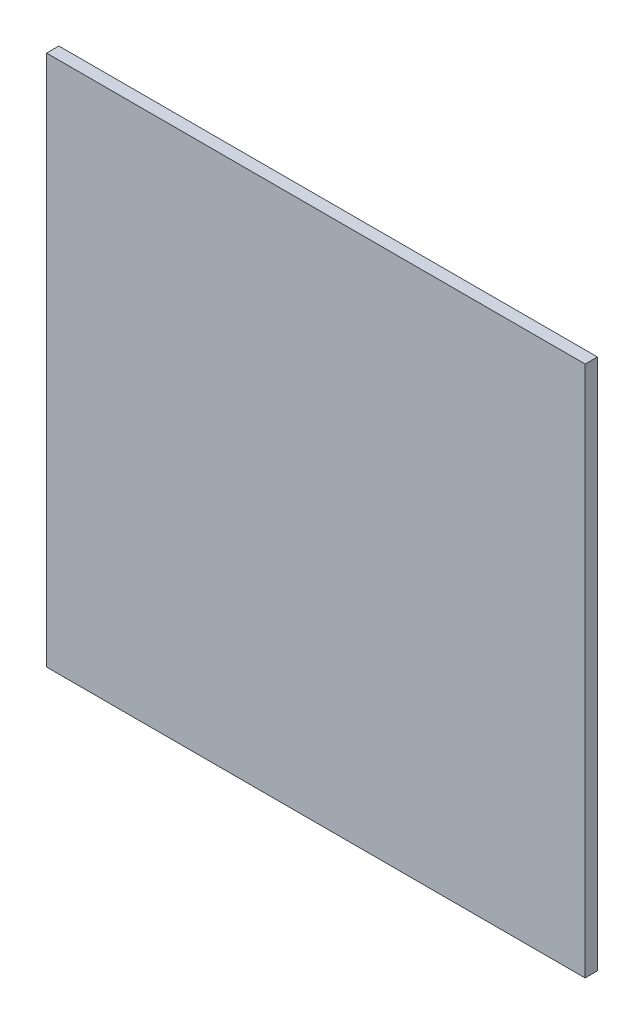
ISO-10303-21;
HEADER;
FILE_DESCRIPTION(('STEP AP214'),'2;1');
FILE_NAME('part.step','',(''),(''),'','','');
FILE_SCHEMA(('AUTOMOTIVE_DESIGN { 1 0 10303 214 1 1 1 1 }'));
ENDSEC;
DATA;
#1=APPLICATION_CONTEXT('core data for automotive mechanical design processes');
#2=APPLICATION_PROTOCOL_DEFINITION('international standard','automotive_design',2000,#1);
#3=PRODUCT_CONTEXT('',#1,'mechanical');
#4=PRODUCT('Part','Part','',(#3));
#5=PRODUCT_RELATED_PRODUCT_CATEGORY('part','',(#4));
#6=PRODUCT_DEFINITION_FORMATION('','',#4);
#7=PRODUCT_DEFINITION_CONTEXT('part definition',#1,'design');
#8=PRODUCT_DEFINITION('design','',#6,#7);
#9=PRODUCT_DEFINITION_SHAPE('','',#8);
#10=(LENGTH_UNIT() NAMED_UNIT(*) SI_UNIT(.MILLI.,.METRE.));
#11=(NAMED_UNIT(*) PLANE_ANGLE_UNIT() SI_UNIT($,.RADIAN.));
#12=(NAMED_UNIT(*) SI_UNIT($,.STERADIAN.) SOLID_ANGLE_UNIT());
#13=UNCERTAINTY_MEASURE_WITH_UNIT(LENGTH_MEASURE(1.E-05),#10,'distance_accuracy_value','');
#14=(GEOMETRIC_REPRESENTATION_CONTEXT(3) GLOBAL_UNCERTAINTY_ASSIGNED_CONTEXT((#13)) GLOBAL_UNIT_ASSIGNED_CONTEXT((#10,
#11,#12)) REPRESENTATION_CONTEXT('',''));
#15=CARTESIAN_POINT('',(0.,0.,0.));
#16=DIRECTION('',(0.,0.,1.));
#17=DIRECTION('',(1.,0.,0.));
#18=AXIS2_PLACEMENT_3D('',#15,#16,#17);
#19=CARTESIAN_POINT('',(-28.6061320754717,15.0849056603774,9.));
#20=DIRECTION('',(1.,0.,0.));
#21=DIRECTION('',(0.,1.,0.));
#22=AXIS2_PLACEMENT_3D('',#19,#20,#21);
#23=PLANE('',#22);
#24=DIRECTION('',(0.,-1.,0.));
#25=VECTOR('',#24,1.);
#26=CARTESIAN_POINT('',(-28.6061320754717,15.0849056603774,0.));
#27=LINE('',#26,#25);
#28=CARTESIAN_POINT('',(-28.6061320754717,15.0849056603774,0.));
#29=VERTEX_POINT('',#28);
#30=CARTESIAN_POINT('',(-28.6061320754717,-374.915094339623,0.));
#31=VERTEX_POINT('',#30);
#32=EDGE_CURVE('E98',#29,#31,#27,.T.);
#33=ORIENTED_EDGE('',*,*,#32,.T.);
#34=DIRECTION('',(0.,0.,-1.));
#35=VECTOR('',#34,1.);
#36=CARTESIAN_POINT('',(-28.6061320754717,-374.915094339623,9.));
#37=LINE('',#36,#35);
#38=CARTESIAN_POINT('',(-28.6061320754717,-374.915094339623,9.));
#39=VERTEX_POINT('',#38);
#40=EDGE_CURVE('E11',#39,#31,#37,.T.);
#41=ORIENTED_EDGE('',*,*,#40,.F.);
#42=DIRECTION('',(0.,-1.,0.));
#43=VECTOR('',#42,1.);
#44=CARTESIAN_POINT('',(-28.6061320754717,15.0849056603774,9.));
#45=LINE('',#44,#43);
#46=CARTESIAN_POINT('',(-28.6061320754717,15.0849056603774,9.));
#47=VERTEX_POINT('',#46);
#48=EDGE_CURVE('E86',#47,#39,#45,.T.);
#49=ORIENTED_EDGE('',*,*,#48,.F.);
#50=DIRECTION('',(0.,0.,-1.));
#51=VECTOR('',#50,1.);
#52=CARTESIAN_POINT('',(-28.6061320754717,15.0849056603774,9.));
#53=LINE('',#52,#51);
#54=EDGE_CURVE('E94',#47,#29,#53,.T.);
#55=ORIENTED_EDGE('',*,*,#54,.T.);
#56=EDGE_LOOP('',(#33,#41,#49,#55));
#57=FACE_BOUND('',#56,.T.);
#58=ADVANCED_FACE('F35',(#57),#23,.F.);
#59=CARTESIAN_POINT('',(-28.6061320754717,-374.915094339623,9.));
#60=DIRECTION('',(0.,1.,0.));
#61=DIRECTION('',(0.,0.,1.));
#62=AXIS2_PLACEMENT_3D('',#59,#60,#61);
#63=PLANE('',#62);
#64=DIRECTION('',(1.,0.,0.));
#65=VECTOR('',#64,1.);
#66=CARTESIAN_POINT('',(-28.6061320754717,-374.915094339623,0.));
#67=LINE('',#66,#65);
#68=CARTESIAN_POINT('',(366.393867924528,-374.915094339623,0.));
#69=VERTEX_POINT('',#68);
#70=EDGE_CURVE('E90',#31,#69,#67,.T.);
#71=ORIENTED_EDGE('',*,*,#70,.T.);
#72=DIRECTION('',(0.,0.,-1.));
#73=VECTOR('',#72,1.);
#74=CARTESIAN_POINT('',(366.393867924528,-374.915094339623,9.));
#75=LINE('',#74,#73);
#76=CARTESIAN_POINT('',(366.393867924528,-374.915094339623,9.));
#77=VERTEX_POINT('',#76);
#78=EDGE_CURVE('E43',#77,#69,#75,.T.);
#79=ORIENTED_EDGE('',*,*,#78,.F.);
#80=DIRECTION('',(1.,0.,0.));
#81=VECTOR('',#80,1.);
#82=CARTESIAN_POINT('',(-28.6061320754717,-374.915094339623,9.));
#83=LINE('',#82,#81);
#84=EDGE_CURVE('E81',#39,#77,#83,.T.);
#85=ORIENTED_EDGE('',*,*,#84,.F.);
#86=ORIENTED_EDGE('',*,*,#40,.T.);
#87=EDGE_LOOP('',(#71,#79,#85,#86));
#88=FACE_BOUND('',#87,.T.);
#89=ADVANCED_FACE('F89',(#88),#63,.F.);
#90=CARTESIAN_POINT('',(366.393867924528,15.0849056603774,9.));
#91=DIRECTION('',(-1.,0.,0.));
#92=DIRECTION('',(0.,-1.,0.));
#93=AXIS2_PLACEMENT_3D('',#90,#91,#92);
#94=PLANE('',#93);
#95=DIRECTION('',(0.,1.,0.));
#96=VECTOR('',#95,1.);
#97=CARTESIAN_POINT('',(366.393867924528,15.0849056603774,0.));
#98=LINE('',#97,#96);
#99=CARTESIAN_POINT('',(366.393867924528,15.0849056603774,0.));
#100=VERTEX_POINT('',#99);
#101=EDGE_CURVE('E68',#69,#100,#98,.T.);
#102=ORIENTED_EDGE('',*,*,#101,.T.);
#103=DIRECTION('',(0.,0.,-1.));
#104=VECTOR('',#103,1.);
#105=CARTESIAN_POINT('',(366.393867924528,15.0849056603774,9.));
#106=LINE('',#105,#104);
#107=CARTESIAN_POINT('',(366.393867924528,15.0849056603774,9.));
#108=VERTEX_POINT('',#107);
#109=EDGE_CURVE('E91',#108,#100,#106,.T.);
#110=ORIENTED_EDGE('',*,*,#109,.F.);
#111=DIRECTION('',(0.,1.,0.));
#112=VECTOR('',#111,1.);
#113=CARTESIAN_POINT('',(366.393867924528,15.0849056603774,9.));
#114=LINE('',#113,#112);
#115=EDGE_CURVE('E84',#77,#108,#114,.T.);
#116=ORIENTED_EDGE('',*,*,#115,.F.);
#117=ORIENTED_EDGE('',*,*,#78,.T.);
#118=EDGE_LOOP('',(#102,#110,#116,#117));
#119=FACE_BOUND('',#118,.T.);
#120=ADVANCED_FACE('F92',(#119),#94,.F.);
#121=CARTESIAN_POINT('',(-28.6061320754717,15.0849056603774,9.));
#122=DIRECTION('',(0.,-1.,0.));
#123=DIRECTION('',(0.,0.,-1.));
#124=AXIS2_PLACEMENT_3D('',#121,#122,#123);
#125=PLANE('',#124);
#126=DIRECTION('',(-1.,0.,0.));
#127=VECTOR('',#126,1.);
#128=CARTESIAN_POINT('',(-28.6061320754717,15.0849056603774,0.));
#129=LINE('',#128,#127);
#130=EDGE_CURVE('E74',#100,#29,#129,.T.);
#131=ORIENTED_EDGE('',*,*,#130,.T.);
#132=ORIENTED_EDGE('',*,*,#54,.F.);
#133=DIRECTION('',(-1.,0.,0.));
#134=VECTOR('',#133,1.);
#135=CARTESIAN_POINT('',(-28.6061320754717,15.0849056603774,9.));
#136=LINE('',#135,#134);
#137=EDGE_CURVE('E51',#108,#47,#136,.T.);
#138=ORIENTED_EDGE('',*,*,#137,.F.);
#139=ORIENTED_EDGE('',*,*,#109,.T.);
#140=EDGE_LOOP('',(#131,#132,#138,#139));
#141=FACE_BOUND('',#140,.T.);
#142=ADVANCED_FACE('F105',(#141),#125,.F.);
#143=CARTESIAN_POINT('',(0.,0.,9.));
#144=DIRECTION('',(0.,0.,1.));
#145=DIRECTION('',(1.,0.,0.));
#146=AXIS2_PLACEMENT_3D('',#143,#144,#145);
#147=PLANE('',#146);
#148=ORIENTED_EDGE('',*,*,#48,.T.);
#149=ORIENTED_EDGE('',*,*,#84,.T.);
#150=ORIENTED_EDGE('',*,*,#115,.T.);
#151=ORIENTED_EDGE('',*,*,#137,.T.);
#152=EDGE_LOOP('',(#148,#149,#150,#151));
#153=FACE_BOUND('',#152,.T.);
#154=ADVANCED_FACE('F82',(#153),#147,.T.);
#155=CARTESIAN_POINT('',(0.,0.,0.));
#156=DIRECTION('',(0.,0.,1.));
#157=DIRECTION('',(1.,0.,0.));
#158=AXIS2_PLACEMENT_3D('',#155,#156,#157);
#159=PLANE('',#158);
#160=ORIENTED_EDGE('',*,*,#32,.F.);
#161=ORIENTED_EDGE('',*,*,#130,.F.);
#162=ORIENTED_EDGE('',*,*,#101,.F.);
#163=ORIENTED_EDGE('',*,*,#70,.F.);
#164=EDGE_LOOP('',(#160,#161,#162,#163));
#165=FACE_BOUND('',#164,.T.);
#166=ADVANCED_FACE('F108',(#165),#159,.F.);
#167=CLOSED_SHELL('',(#58,#89,#120,#142,#154,#166));
#168=MANIFOLD_SOLID_BREP('B2',#167);
#169=ADVANCED_BREP_SHAPE_REPRESENTATION('',(#18,#168),#14);
#170=SHAPE_DEFINITION_REPRESENTATION(#9,#169);
ENDSEC;
END-ISO-10303-21;
